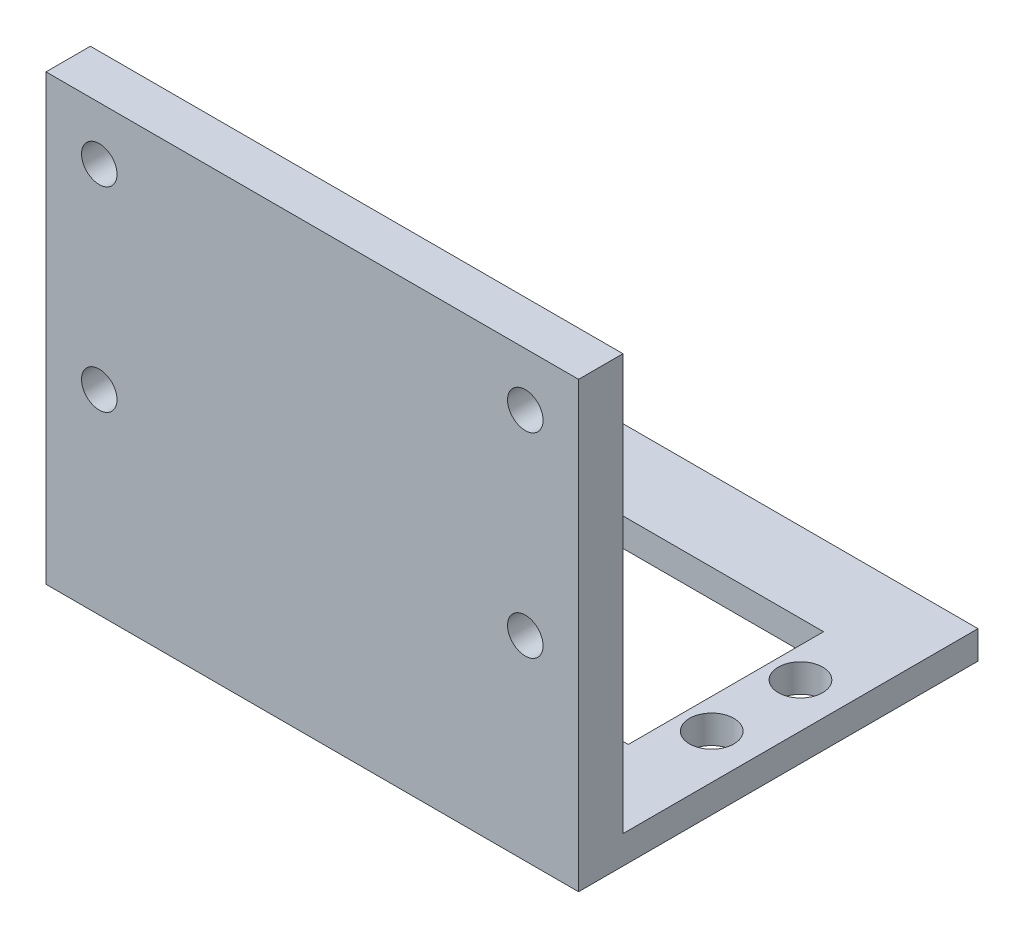
ISO-10303-21;
HEADER;
FILE_DESCRIPTION(('STEP AP214'),'2;1');
FILE_NAME('part.step','',(''),(''),'','','');
FILE_SCHEMA(('AUTOMOTIVE_DESIGN { 1 0 10303 214 1 1 1 1 }'));
ENDSEC;
DATA;
#1=APPLICATION_CONTEXT('core data for automotive mechanical design processes');
#2=APPLICATION_PROTOCOL_DEFINITION('international standard','automotive_design',2000,#1);
#3=PRODUCT_CONTEXT('',#1,'mechanical');
#4=PRODUCT('Part','Part','',(#3));
#5=PRODUCT_RELATED_PRODUCT_CATEGORY('part','',(#4));
#6=PRODUCT_DEFINITION_FORMATION('','',#4);
#7=PRODUCT_DEFINITION_CONTEXT('part definition',#1,'design');
#8=PRODUCT_DEFINITION('design','',#6,#7);
#9=PRODUCT_DEFINITION_SHAPE('','',#8);
#10=(LENGTH_UNIT() NAMED_UNIT(*) SI_UNIT(.MILLI.,.METRE.));
#11=(NAMED_UNIT(*) PLANE_ANGLE_UNIT() SI_UNIT($,.RADIAN.));
#12=(NAMED_UNIT(*) SI_UNIT($,.STERADIAN.) SOLID_ANGLE_UNIT());
#13=UNCERTAINTY_MEASURE_WITH_UNIT(LENGTH_MEASURE(1.E-05),#10,'distance_accuracy_value','');
#14=(GEOMETRIC_REPRESENTATION_CONTEXT(3) GLOBAL_UNCERTAINTY_ASSIGNED_CONTEXT((#13)) GLOBAL_UNIT_ASSIGNED_CONTEXT((#10,
#11,#12)) REPRESENTATION_CONTEXT('',''));
#15=CARTESIAN_POINT('',(0.,0.,0.));
#16=DIRECTION('',(0.,0.,1.));
#17=DIRECTION('',(1.,0.,0.));
#18=AXIS2_PLACEMENT_3D('',#15,#16,#17);
#19=CARTESIAN_POINT('',(0.,3.175,0.));
#20=DIRECTION('',(0.,1.,0.));
#21=DIRECTION('',(0.,0.,1.));
#22=AXIS2_PLACEMENT_3D('',#19,#20,#21);
#23=PLANE('',#22);
#24=CARTESIAN_POINT('',(-23.8,3.175,5.00000000000001));
#25=DIRECTION('',(0.,1.,0.));
#26=DIRECTION('',(0.,0.,1.));
#27=AXIS2_PLACEMENT_3D('',#24,#25,#26);
#28=CIRCLE('',#27,2.5);
#29=CARTESIAN_POINT('',(-23.8,3.175,7.50000000000001));
#30=VERTEX_POINT('',#29);
#31=EDGE_CURVE('E192',#30,#30,#28,.T.);
#32=ORIENTED_EDGE('',*,*,#31,.F.);
#33=EDGE_LOOP('',(#32));
#34=FACE_BOUND('',#33,.T.);
#35=CARTESIAN_POINT('',(-23.8,3.175,-4.99999999999999));
#36=DIRECTION('',(0.,1.,0.));
#37=DIRECTION('',(0.,0.,1.));
#38=AXIS2_PLACEMENT_3D('',#35,#36,#37);
#39=CIRCLE('',#38,2.5);
#40=CARTESIAN_POINT('',(-23.8,3.175,-2.49999999999999));
#41=VERTEX_POINT('',#40);
#42=EDGE_CURVE('E127',#41,#41,#39,.T.);
#43=ORIENTED_EDGE('',*,*,#42,.F.);
#44=EDGE_LOOP('',(#43));
#45=FACE_BOUND('',#44,.T.);
#46=DIRECTION('',(0.,0.,1.));
#47=VECTOR('',#46,1.);
#48=CARTESIAN_POINT('',(-30.,3.175,20.));
#49=LINE('',#48,#47);
#50=CARTESIAN_POINT('',(-30.,3.175,-20.));
#51=VERTEX_POINT('',#50);
#52=CARTESIAN_POINT('',(-30.,3.175,20.));
#53=VERTEX_POINT('',#52);
#54=EDGE_CURVE('E208',#51,#53,#49,.T.);
#55=ORIENTED_EDGE('',*,*,#54,.T.);
#56=DIRECTION('',(1.,0.,0.));
#57=VECTOR('',#56,1.);
#58=CARTESIAN_POINT('',(30.,3.175,20.));
#59=LINE('',#58,#57);
#60=CARTESIAN_POINT('',(30.,3.175,20.));
#61=VERTEX_POINT('',#60);
#62=EDGE_CURVE('E211',#53,#61,#59,.T.);
#63=ORIENTED_EDGE('',*,*,#62,.T.);
#64=DIRECTION('',(0.,0.,-1.));
#65=VECTOR('',#64,1.);
#66=CARTESIAN_POINT('',(30.,3.175,20.));
#67=LINE('',#66,#65);
#68=CARTESIAN_POINT('',(30.,3.175,-20.));
#69=VERTEX_POINT('',#68);
#70=EDGE_CURVE('E215',#61,#69,#67,.T.);
#71=ORIENTED_EDGE('',*,*,#70,.T.);
#72=DIRECTION('',(-1.,0.,0.));
#73=VECTOR('',#72,1.);
#74=CARTESIAN_POINT('',(30.,3.175,-20.));
#75=LINE('',#74,#73);
#76=EDGE_CURVE('E217',#69,#51,#75,.T.);
#77=ORIENTED_EDGE('',*,*,#76,.T.);
#78=EDGE_LOOP('',(#55,#63,#71,#77));
#79=FACE_BOUND('',#78,.T.);
#80=CARTESIAN_POINT('',(25.,3.175,-5.));
#81=DIRECTION('',(0.,1.,0.));
#82=DIRECTION('',(0.,0.,1.));
#83=AXIS2_PLACEMENT_3D('',#80,#81,#82);
#84=CIRCLE('',#83,2.5);
#85=CARTESIAN_POINT('',(25.,3.175,-2.5));
#86=VERTEX_POINT('',#85);
#87=EDGE_CURVE('E198',#86,#86,#84,.T.);
#88=ORIENTED_EDGE('',*,*,#87,.F.);
#89=EDGE_LOOP('',(#88));
#90=FACE_BOUND('',#89,.T.);
#91=CARTESIAN_POINT('',(25.,3.175,5.));
#92=DIRECTION('',(0.,1.,0.));
#93=DIRECTION('',(0.,0.,1.));
#94=AXIS2_PLACEMENT_3D('',#91,#92,#93);
#95=CIRCLE('',#94,2.5);
#96=CARTESIAN_POINT('',(25.,3.175,7.5));
#97=VERTEX_POINT('',#96);
#98=EDGE_CURVE('E186',#97,#97,#95,.T.);
#99=ORIENTED_EDGE('',*,*,#98,.F.);
#100=EDGE_LOOP('',(#99));
#101=FACE_BOUND('',#100,.T.);
#102=DIRECTION('',(1.,0.,0.));
#103=VECTOR('',#102,1.);
#104=CARTESIAN_POINT('',(21.6,3.175,11.));
#105=LINE('',#104,#103);
#106=CARTESIAN_POINT('',(-20.4,3.175,11.));
#107=VERTEX_POINT('',#106);
#108=CARTESIAN_POINT('',(21.6,3.175,11.));
#109=VERTEX_POINT('',#108);
#110=EDGE_CURVE('E162',#107,#109,#105,.T.);
#111=ORIENTED_EDGE('',*,*,#110,.F.);
#112=DIRECTION('',(0.,0.,1.));
#113=VECTOR('',#112,1.);
#114=CARTESIAN_POINT('',(-20.4,3.175,11.));
#115=LINE('',#114,#113);
#116=CARTESIAN_POINT('',(-20.4,3.175,-11.));
#117=VERTEX_POINT('',#116);
#118=EDGE_CURVE('E160',#117,#107,#115,.T.);
#119=ORIENTED_EDGE('',*,*,#118,.F.);
#120=DIRECTION('',(-1.,0.,0.));
#121=VECTOR('',#120,1.);
#122=CARTESIAN_POINT('',(21.6,3.175,-11.));
#123=LINE('',#122,#121);
#124=CARTESIAN_POINT('',(21.6,3.175,-11.));
#125=VERTEX_POINT('',#124);
#126=EDGE_CURVE('E167',#125,#117,#123,.T.);
#127=ORIENTED_EDGE('',*,*,#126,.F.);
#128=DIRECTION('',(0.,0.,-1.));
#129=VECTOR('',#128,1.);
#130=CARTESIAN_POINT('',(21.6,3.175,11.));
#131=LINE('',#130,#129);
#132=EDGE_CURVE('E165',#109,#125,#131,.T.);
#133=ORIENTED_EDGE('',*,*,#132,.F.);
#134=EDGE_LOOP('',(#111,#119,#127,#133));
#135=FACE_BOUND('',#134,.T.);
#136=ADVANCED_FACE('F37',(#34,#45,#79,#90,#101,#135),#23,.T.);
#137=CARTESIAN_POINT('',(0.,0.,0.));
#138=DIRECTION('',(0.,1.,0.));
#139=DIRECTION('',(0.,0.,1.));
#140=AXIS2_PLACEMENT_3D('',#137,#138,#139);
#141=PLANE('',#140);
#142=CARTESIAN_POINT('',(25.,0.,5.));
#143=DIRECTION('',(0.,1.,0.));
#144=DIRECTION('',(0.,0.,1.));
#145=AXIS2_PLACEMENT_3D('',#142,#143,#144);
#146=CIRCLE('',#145,2.5);
#147=CARTESIAN_POINT('',(25.,0.,7.5));
#148=VERTEX_POINT('',#147);
#149=EDGE_CURVE('E185',#148,#148,#146,.T.);
#150=ORIENTED_EDGE('',*,*,#149,.T.);
#151=EDGE_LOOP('',(#150));
#152=FACE_BOUND('',#151,.T.);
#153=CARTESIAN_POINT('',(-23.8,0.,5.00000000000001));
#154=DIRECTION('',(0.,1.,0.));
#155=DIRECTION('',(0.,0.,1.));
#156=AXIS2_PLACEMENT_3D('',#153,#154,#155);
#157=CIRCLE('',#156,2.5);
#158=CARTESIAN_POINT('',(-23.8,0.,7.50000000000001));
#159=VERTEX_POINT('',#158);
#160=EDGE_CURVE('E189',#159,#159,#157,.T.);
#161=ORIENTED_EDGE('',*,*,#160,.T.);
#162=EDGE_LOOP('',(#161));
#163=FACE_BOUND('',#162,.T.);
#164=CARTESIAN_POINT('',(25.,0.,-5.));
#165=DIRECTION('',(0.,1.,0.));
#166=DIRECTION('',(0.,0.,1.));
#167=AXIS2_PLACEMENT_3D('',#164,#165,#166);
#168=CIRCLE('',#167,2.5);
#169=CARTESIAN_POINT('',(25.,0.,-2.5));
#170=VERTEX_POINT('',#169);
#171=EDGE_CURVE('E195',#170,#170,#168,.T.);
#172=ORIENTED_EDGE('',*,*,#171,.T.);
#173=EDGE_LOOP('',(#172));
#174=FACE_BOUND('',#173,.T.);
#175=CARTESIAN_POINT('',(-23.8,0.,-4.99999999999999));
#176=DIRECTION('',(0.,1.,0.));
#177=DIRECTION('',(0.,0.,1.));
#178=AXIS2_PLACEMENT_3D('',#175,#176,#177);
#179=CIRCLE('',#178,2.5);
#180=CARTESIAN_POINT('',(-23.8,0.,-2.49999999999999));
#181=VERTEX_POINT('',#180);
#182=EDGE_CURVE('E201',#181,#181,#179,.T.);
#183=ORIENTED_EDGE('',*,*,#182,.T.);
#184=EDGE_LOOP('',(#183));
#185=FACE_BOUND('',#184,.T.);
#186=DIRECTION('',(0.,0.,1.));
#187=VECTOR('',#186,1.);
#188=CARTESIAN_POINT('',(-30.,0.,20.));
#189=LINE('',#188,#187);
#190=CARTESIAN_POINT('',(-30.,0.,-20.));
#191=VERTEX_POINT('',#190);
#192=CARTESIAN_POINT('',(-30.,0.,25.));
#193=VERTEX_POINT('',#192);
#194=EDGE_CURVE('E117',#191,#193,#189,.T.);
#195=ORIENTED_EDGE('',*,*,#194,.F.);
#196=DIRECTION('',(-1.,0.,0.));
#197=VECTOR('',#196,1.);
#198=CARTESIAN_POINT('',(30.,0.,-20.));
#199=LINE('',#198,#197);
#200=CARTESIAN_POINT('',(30.,0.,-20.));
#201=VERTEX_POINT('',#200);
#202=EDGE_CURVE('E212',#201,#191,#199,.T.);
#203=ORIENTED_EDGE('',*,*,#202,.F.);
#204=DIRECTION('',(0.,0.,-1.));
#205=VECTOR('',#204,1.);
#206=CARTESIAN_POINT('',(30.,0.,20.));
#207=LINE('',#206,#205);
#208=CARTESIAN_POINT('',(30.,0.,25.));
#209=VERTEX_POINT('',#208);
#210=EDGE_CURVE('E126',#209,#201,#207,.T.);
#211=ORIENTED_EDGE('',*,*,#210,.F.);
#212=DIRECTION('',(1.,0.,0.));
#213=VECTOR('',#212,1.);
#214=CARTESIAN_POINT('',(-30.,0.,25.));
#215=LINE('',#214,#213);
#216=EDGE_CURVE('E130',#193,#209,#215,.T.);
#217=ORIENTED_EDGE('',*,*,#216,.F.);
#218=EDGE_LOOP('',(#195,#203,#211,#217));
#219=FACE_BOUND('',#218,.T.);
#220=DIRECTION('',(0.,0.,1.));
#221=VECTOR('',#220,1.);
#222=CARTESIAN_POINT('',(-20.4,0.,11.));
#223=LINE('',#222,#221);
#224=CARTESIAN_POINT('',(-20.4,0.,-11.));
#225=VERTEX_POINT('',#224);
#226=CARTESIAN_POINT('',(-20.4,0.,11.));
#227=VERTEX_POINT('',#226);
#228=EDGE_CURVE('E60',#225,#227,#223,.T.);
#229=ORIENTED_EDGE('',*,*,#228,.T.);
#230=DIRECTION('',(1.,0.,0.));
#231=VECTOR('',#230,1.);
#232=CARTESIAN_POINT('',(21.6,0.,11.));
#233=LINE('',#232,#231);
#234=CARTESIAN_POINT('',(21.6,0.,11.));
#235=VERTEX_POINT('',#234);
#236=EDGE_CURVE('E171',#227,#235,#233,.T.);
#237=ORIENTED_EDGE('',*,*,#236,.T.);
#238=DIRECTION('',(0.,0.,-1.));
#239=VECTOR('',#238,1.);
#240=CARTESIAN_POINT('',(21.6,0.,11.));
#241=LINE('',#240,#239);
#242=CARTESIAN_POINT('',(21.6,0.,-11.));
#243=VERTEX_POINT('',#242);
#244=EDGE_CURVE('E174',#235,#243,#241,.T.);
#245=ORIENTED_EDGE('',*,*,#244,.T.);
#246=DIRECTION('',(-1.,0.,0.));
#247=VECTOR('',#246,1.);
#248=CARTESIAN_POINT('',(21.6,0.,-11.));
#249=LINE('',#248,#247);
#250=EDGE_CURVE('E163',#243,#225,#249,.T.);
#251=ORIENTED_EDGE('',*,*,#250,.T.);
#252=EDGE_LOOP('',(#229,#237,#245,#251));
#253=FACE_BOUND('',#252,.T.);
#254=ADVANCED_FACE('F131',(#152,#163,#174,#185,#219,#253),#141,.F.);
#255=CARTESIAN_POINT('',(-30.,3.175,20.));
#256=DIRECTION('',(1.,0.,0.));
#257=DIRECTION('',(0.,0.,-1.));
#258=AXIS2_PLACEMENT_3D('',#255,#256,#257);
#259=PLANE('',#258);
#260=ORIENTED_EDGE('',*,*,#194,.T.);
#261=DIRECTION('',(0.,-1.,0.));
#262=VECTOR('',#261,1.);
#263=CARTESIAN_POINT('',(-30.,0.,25.));
#264=LINE('',#263,#262);
#265=CARTESIAN_POINT('',(-30.,50.,25.));
#266=VERTEX_POINT('',#265);
#267=EDGE_CURVE('E121',#266,#193,#264,.T.);
#268=ORIENTED_EDGE('',*,*,#267,.F.);
#269=DIRECTION('',(0.,0.,-1.));
#270=VECTOR('',#269,1.);
#271=CARTESIAN_POINT('',(-30.,50.,25.));
#272=LINE('',#271,#270);
#273=CARTESIAN_POINT('',(-30.,50.,20.));
#274=VERTEX_POINT('',#273);
#275=EDGE_CURVE('E151',#266,#274,#272,.T.);
#276=ORIENTED_EDGE('',*,*,#275,.T.);
#277=DIRECTION('',(0.,-1.,0.));
#278=VECTOR('',#277,1.);
#279=CARTESIAN_POINT('',(-30.,0.,20.));
#280=LINE('',#279,#278);
#281=EDGE_CURVE('E152',#274,#53,#280,.T.);
#282=ORIENTED_EDGE('',*,*,#281,.T.);
#283=ORIENTED_EDGE('',*,*,#54,.F.);
#284=DIRECTION('',(0.,-1.,0.));
#285=VECTOR('',#284,1.);
#286=CARTESIAN_POINT('',(-30.,3.175,-20.));
#287=LINE('',#286,#285);
#288=EDGE_CURVE('E45',#51,#191,#287,.T.);
#289=ORIENTED_EDGE('',*,*,#288,.T.);
#290=EDGE_LOOP('',(#260,#268,#276,#282,#283,#289));
#291=FACE_BOUND('',#290,.T.);
#292=ADVANCED_FACE('F39',(#291),#259,.F.);
#293=CARTESIAN_POINT('',(30.,3.175,20.));
#294=DIRECTION('',(-1.,0.,0.));
#295=DIRECTION('',(0.,0.,1.));
#296=AXIS2_PLACEMENT_3D('',#293,#294,#295);
#297=PLANE('',#296);
#298=ORIENTED_EDGE('',*,*,#210,.T.);
#299=DIRECTION('',(0.,-1.,0.));
#300=VECTOR('',#299,1.);
#301=CARTESIAN_POINT('',(30.,3.175,-20.));
#302=LINE('',#301,#300);
#303=EDGE_CURVE('E11',#69,#201,#302,.T.);
#304=ORIENTED_EDGE('',*,*,#303,.F.);
#305=ORIENTED_EDGE('',*,*,#70,.F.);
#306=DIRECTION('',(0.,1.,0.));
#307=VECTOR('',#306,1.);
#308=CARTESIAN_POINT('',(30.,0.,20.));
#309=LINE('',#308,#307);
#310=CARTESIAN_POINT('',(30.,50.,20.));
#311=VERTEX_POINT('',#310);
#312=EDGE_CURVE('E143',#61,#311,#309,.T.);
#313=ORIENTED_EDGE('',*,*,#312,.T.);
#314=DIRECTION('',(0.,0.,-1.));
#315=VECTOR('',#314,1.);
#316=CARTESIAN_POINT('',(30.,50.,25.));
#317=LINE('',#316,#315);
#318=CARTESIAN_POINT('',(30.,50.,25.));
#319=VERTEX_POINT('',#318);
#320=EDGE_CURVE('E157',#319,#311,#317,.T.);
#321=ORIENTED_EDGE('',*,*,#320,.F.);
#322=DIRECTION('',(0.,1.,0.));
#323=VECTOR('',#322,1.);
#324=CARTESIAN_POINT('',(30.,0.,25.));
#325=LINE('',#324,#323);
#326=EDGE_CURVE('E135',#209,#319,#325,.T.);
#327=ORIENTED_EDGE('',*,*,#326,.F.);
#328=EDGE_LOOP('',(#298,#304,#305,#313,#321,#327));
#329=FACE_BOUND('',#328,.T.);
#330=ADVANCED_FACE('F226',(#329),#297,.F.);
#331=CARTESIAN_POINT('',(30.,3.175,-20.));
#332=DIRECTION('',(0.,0.,1.));
#333=DIRECTION('',(1.,0.,0.));
#334=AXIS2_PLACEMENT_3D('',#331,#332,#333);
#335=PLANE('',#334);
#336=ORIENTED_EDGE('',*,*,#202,.T.);
#337=ORIENTED_EDGE('',*,*,#288,.F.);
#338=ORIENTED_EDGE('',*,*,#76,.F.);
#339=ORIENTED_EDGE('',*,*,#303,.T.);
#340=EDGE_LOOP('',(#336,#337,#338,#339));
#341=FACE_BOUND('',#340,.T.);
#342=ADVANCED_FACE('F221',(#341),#335,.F.);
#343=CARTESIAN_POINT('',(-23.8,3.175,-4.99999999999999));
#344=DIRECTION('',(0.,-1.,0.));
#345=DIRECTION('',(0.,0.,-1.));
#346=AXIS2_PLACEMENT_3D('',#343,#344,#345);
#347=CYLINDRICAL_SURFACE('',#346,2.5);
#348=ORIENTED_EDGE('',*,*,#42,.T.);
#349=EDGE_LOOP('',(#348));
#350=FACE_BOUND('',#349,.T.);
#351=ORIENTED_EDGE('',*,*,#182,.F.);
#352=EDGE_LOOP('',(#351));
#353=FACE_BOUND('',#352,.T.);
#354=ADVANCED_FACE('F282',(#350,#353),#347,.F.);
#355=CARTESIAN_POINT('',(25.,3.175,-5.));
#356=DIRECTION('',(0.,-1.,0.));
#357=DIRECTION('',(0.,0.,-1.));
#358=AXIS2_PLACEMENT_3D('',#355,#356,#357);
#359=CYLINDRICAL_SURFACE('',#358,2.5);
#360=ORIENTED_EDGE('',*,*,#87,.T.);
#361=EDGE_LOOP('',(#360));
#362=FACE_BOUND('',#361,.T.);
#363=ORIENTED_EDGE('',*,*,#171,.F.);
#364=EDGE_LOOP('',(#363));
#365=FACE_BOUND('',#364,.T.);
#366=ADVANCED_FACE('F278',(#362,#365),#359,.F.);
#367=CARTESIAN_POINT('',(-23.8,3.175,5.00000000000001));
#368=DIRECTION('',(0.,-1.,0.));
#369=DIRECTION('',(0.,0.,-1.));
#370=AXIS2_PLACEMENT_3D('',#367,#368,#369);
#371=CYLINDRICAL_SURFACE('',#370,2.5);
#372=ORIENTED_EDGE('',*,*,#31,.T.);
#373=EDGE_LOOP('',(#372));
#374=FACE_BOUND('',#373,.T.);
#375=ORIENTED_EDGE('',*,*,#160,.F.);
#376=EDGE_LOOP('',(#375));
#377=FACE_BOUND('',#376,.T.);
#378=ADVANCED_FACE('F274',(#374,#377),#371,.F.);
#379=CARTESIAN_POINT('',(25.,3.175,5.));
#380=DIRECTION('',(0.,-1.,0.));
#381=DIRECTION('',(0.,0.,-1.));
#382=AXIS2_PLACEMENT_3D('',#379,#380,#381);
#383=CYLINDRICAL_SURFACE('',#382,2.5);
#384=ORIENTED_EDGE('',*,*,#98,.T.);
#385=EDGE_LOOP('',(#384));
#386=FACE_BOUND('',#385,.T.);
#387=ORIENTED_EDGE('',*,*,#149,.F.);
#388=EDGE_LOOP('',(#387));
#389=FACE_BOUND('',#388,.T.);
#390=ADVANCED_FACE('F271',(#386,#389),#383,.F.);
#391=CARTESIAN_POINT('',(-20.4,3.175,11.));
#392=DIRECTION('',(1.,0.,0.));
#393=DIRECTION('',(0.,0.,-1.));
#394=AXIS2_PLACEMENT_3D('',#391,#392,#393);
#395=PLANE('',#394);
#396=ORIENTED_EDGE('',*,*,#228,.F.);
#397=DIRECTION('',(0.,-1.,0.));
#398=VECTOR('',#397,1.);
#399=CARTESIAN_POINT('',(-20.4,3.175,-11.));
#400=LINE('',#399,#398);
#401=EDGE_CURVE('E169',#117,#225,#400,.T.);
#402=ORIENTED_EDGE('',*,*,#401,.F.);
#403=ORIENTED_EDGE('',*,*,#118,.T.);
#404=DIRECTION('',(0.,-1.,0.));
#405=VECTOR('',#404,1.);
#406=CARTESIAN_POINT('',(-20.4,3.175,11.));
#407=LINE('',#406,#405);
#408=EDGE_CURVE('E183',#107,#227,#407,.T.);
#409=ORIENTED_EDGE('',*,*,#408,.T.);
#410=EDGE_LOOP('',(#396,#402,#403,#409));
#411=FACE_BOUND('',#410,.T.);
#412=ADVANCED_FACE('F254',(#411),#395,.T.);
#413=CARTESIAN_POINT('',(21.6,3.175,11.));
#414=DIRECTION('',(0.,0.,-1.));
#415=DIRECTION('',(-1.,0.,0.));
#416=AXIS2_PLACEMENT_3D('',#413,#414,#415);
#417=PLANE('',#416);
#418=ORIENTED_EDGE('',*,*,#236,.F.);
#419=ORIENTED_EDGE('',*,*,#408,.F.);
#420=ORIENTED_EDGE('',*,*,#110,.T.);
#421=DIRECTION('',(0.,-1.,0.));
#422=VECTOR('',#421,1.);
#423=CARTESIAN_POINT('',(21.6,3.175,11.));
#424=LINE('',#423,#422);
#425=EDGE_CURVE('E181',#109,#235,#424,.T.);
#426=ORIENTED_EDGE('',*,*,#425,.T.);
#427=EDGE_LOOP('',(#418,#419,#420,#426));
#428=FACE_BOUND('',#427,.T.);
#429=ADVANCED_FACE('F250',(#428),#417,.T.);
#430=CARTESIAN_POINT('',(21.6,3.175,11.));
#431=DIRECTION('',(-1.,0.,0.));
#432=DIRECTION('',(0.,0.,1.));
#433=AXIS2_PLACEMENT_3D('',#430,#431,#432);
#434=PLANE('',#433);
#435=ORIENTED_EDGE('',*,*,#244,.F.);
#436=ORIENTED_EDGE('',*,*,#425,.F.);
#437=ORIENTED_EDGE('',*,*,#132,.T.);
#438=DIRECTION('',(0.,-1.,0.));
#439=VECTOR('',#438,1.);
#440=CARTESIAN_POINT('',(21.6,3.175,-11.));
#441=LINE('',#440,#439);
#442=EDGE_CURVE('E52',#125,#243,#441,.T.);
#443=ORIENTED_EDGE('',*,*,#442,.T.);
#444=EDGE_LOOP('',(#435,#436,#437,#443));
#445=FACE_BOUND('',#444,.T.);
#446=ADVANCED_FACE('F253',(#445),#434,.T.);
#447=CARTESIAN_POINT('',(21.6,3.175,-11.));
#448=DIRECTION('',(0.,0.,1.));
#449=DIRECTION('',(1.,0.,0.));
#450=AXIS2_PLACEMENT_3D('',#447,#448,#449);
#451=PLANE('',#450);
#452=ORIENTED_EDGE('',*,*,#250,.F.);
#453=ORIENTED_EDGE('',*,*,#442,.F.);
#454=ORIENTED_EDGE('',*,*,#126,.T.);
#455=ORIENTED_EDGE('',*,*,#401,.T.);
#456=EDGE_LOOP('',(#452,#453,#454,#455));
#457=FACE_BOUND('',#456,.T.);
#458=ADVANCED_FACE('F255',(#457),#451,.T.);
#459=CARTESIAN_POINT('',(0.,0.,20.));
#460=DIRECTION('',(0.,0.,-1.));
#461=DIRECTION('',(-1.,0.,0.));
#462=AXIS2_PLACEMENT_3D('',#459,#460,#461);
#463=PLANE('',#462);
#464=CARTESIAN_POINT('',(24.,44.,20.));
#465=DIRECTION('',(0.,0.,-1.));
#466=DIRECTION('',(-1.,0.,0.));
#467=AXIS2_PLACEMENT_3D('',#464,#465,#466);
#468=CIRCLE('',#467,1.99999999999999);
#469=CARTESIAN_POINT('',(22.,44.,20.));
#470=VERTEX_POINT('',#469);
#471=EDGE_CURVE('E446',#470,#470,#468,.T.);
#472=ORIENTED_EDGE('',*,*,#471,.F.);
#473=EDGE_LOOP('',(#472));
#474=FACE_BOUND('',#473,.T.);
#475=CARTESIAN_POINT('',(-24.,44.,20.));
#476=DIRECTION('',(0.,0.,-1.));
#477=DIRECTION('',(-1.,0.,0.));
#478=AXIS2_PLACEMENT_3D('',#475,#476,#477);
#479=CIRCLE('',#478,1.99999999999999);
#480=CARTESIAN_POINT('',(-26.,44.,20.));
#481=VERTEX_POINT('',#480);
#482=EDGE_CURVE('E448',#481,#481,#479,.T.);
#483=ORIENTED_EDGE('',*,*,#482,.F.);
#484=EDGE_LOOP('',(#483));
#485=FACE_BOUND('',#484,.T.);
#486=CARTESIAN_POINT('',(24.,22.,20.));
#487=DIRECTION('',(0.,0.,-1.));
#488=DIRECTION('',(-1.,0.,0.));
#489=AXIS2_PLACEMENT_3D('',#486,#487,#488);
#490=CIRCLE('',#489,1.99999999999999);
#491=CARTESIAN_POINT('',(22.,22.,20.));
#492=VERTEX_POINT('',#491);
#493=EDGE_CURVE('E456',#492,#492,#490,.T.);
#494=ORIENTED_EDGE('',*,*,#493,.F.);
#495=EDGE_LOOP('',(#494));
#496=FACE_BOUND('',#495,.T.);
#497=CARTESIAN_POINT('',(-24.,22.,20.));
#498=DIRECTION('',(0.,0.,-1.));
#499=DIRECTION('',(-1.,0.,0.));
#500=AXIS2_PLACEMENT_3D('',#497,#498,#499);
#501=CIRCLE('',#500,1.99999999999999);
#502=CARTESIAN_POINT('',(-26.,22.,20.));
#503=VERTEX_POINT('',#502);
#504=EDGE_CURVE('E461',#503,#503,#501,.T.);
#505=ORIENTED_EDGE('',*,*,#504,.F.);
#506=EDGE_LOOP('',(#505));
#507=FACE_BOUND('',#506,.T.);
#508=ORIENTED_EDGE('',*,*,#62,.F.);
#509=ORIENTED_EDGE('',*,*,#281,.F.);
#510=DIRECTION('',(-1.,0.,0.));
#511=VECTOR('',#510,1.);
#512=CARTESIAN_POINT('',(-30.,50.,20.));
#513=LINE('',#512,#511);
#514=EDGE_CURVE('E141',#311,#274,#513,.T.);
#515=ORIENTED_EDGE('',*,*,#514,.F.);
#516=ORIENTED_EDGE('',*,*,#312,.F.);
#517=EDGE_LOOP('',(#508,#509,#515,#516));
#518=FACE_BOUND('',#517,.T.);
#519=ADVANCED_FACE('F233',(#474,#485,#496,#507,#518),#463,.T.);
#520=CARTESIAN_POINT('',(-30.,50.,25.));
#521=DIRECTION('',(0.,-1.,0.));
#522=DIRECTION('',(0.,0.,-1.));
#523=AXIS2_PLACEMENT_3D('',#520,#521,#522);
#524=PLANE('',#523);
#525=ORIENTED_EDGE('',*,*,#514,.T.);
#526=ORIENTED_EDGE('',*,*,#275,.F.);
#527=DIRECTION('',(-1.,0.,0.));
#528=VECTOR('',#527,1.);
#529=CARTESIAN_POINT('',(-30.,50.,25.));
#530=LINE('',#529,#528);
#531=EDGE_CURVE('E139',#319,#266,#530,.T.);
#532=ORIENTED_EDGE('',*,*,#531,.F.);
#533=ORIENTED_EDGE('',*,*,#320,.T.);
#534=EDGE_LOOP('',(#525,#526,#532,#533));
#535=FACE_BOUND('',#534,.T.);
#536=ADVANCED_FACE('F230',(#535),#524,.F.);
#537=CARTESIAN_POINT('',(0.,0.,25.));
#538=DIRECTION('',(0.,0.,-1.));
#539=DIRECTION('',(-1.,0.,0.));
#540=AXIS2_PLACEMENT_3D('',#537,#538,#539);
#541=PLANE('',#540);
#542=CARTESIAN_POINT('',(24.,44.,25.));
#543=DIRECTION('',(0.,0.,-1.));
#544=DIRECTION('',(-1.,0.,0.));
#545=AXIS2_PLACEMENT_3D('',#542,#543,#544);
#546=CIRCLE('',#545,2.);
#547=CARTESIAN_POINT('',(22.,44.,25.));
#548=VERTEX_POINT('',#547);
#549=EDGE_CURVE('E443',#548,#548,#546,.T.);
#550=ORIENTED_EDGE('',*,*,#549,.T.);
#551=EDGE_LOOP('',(#550));
#552=FACE_BOUND('',#551,.T.);
#553=CARTESIAN_POINT('',(-24.,44.,25.));
#554=DIRECTION('',(0.,0.,-1.));
#555=DIRECTION('',(-1.,0.,0.));
#556=AXIS2_PLACEMENT_3D('',#553,#554,#555);
#557=CIRCLE('',#556,2.);
#558=CARTESIAN_POINT('',(-26.,44.,25.));
#559=VERTEX_POINT('',#558);
#560=EDGE_CURVE('E453',#559,#559,#557,.T.);
#561=ORIENTED_EDGE('',*,*,#560,.T.);
#562=EDGE_LOOP('',(#561));
#563=FACE_BOUND('',#562,.T.);
#564=CARTESIAN_POINT('',(24.,22.,25.));
#565=DIRECTION('',(0.,0.,-1.));
#566=DIRECTION('',(-1.,0.,0.));
#567=AXIS2_PLACEMENT_3D('',#564,#565,#566);
#568=CIRCLE('',#567,2.);
#569=CARTESIAN_POINT('',(22.,22.,25.));
#570=VERTEX_POINT('',#569);
#571=EDGE_CURVE('E459',#570,#570,#568,.T.);
#572=ORIENTED_EDGE('',*,*,#571,.T.);
#573=EDGE_LOOP('',(#572));
#574=FACE_BOUND('',#573,.T.);
#575=CARTESIAN_POINT('',(-24.,22.,25.));
#576=DIRECTION('',(0.,0.,-1.));
#577=DIRECTION('',(-1.,0.,0.));
#578=AXIS2_PLACEMENT_3D('',#575,#576,#577);
#579=CIRCLE('',#578,2.);
#580=CARTESIAN_POINT('',(-26.,22.,25.));
#581=VERTEX_POINT('',#580);
#582=EDGE_CURVE('E146',#581,#581,#579,.T.);
#583=ORIENTED_EDGE('',*,*,#582,.T.);
#584=EDGE_LOOP('',(#583));
#585=FACE_BOUND('',#584,.T.);
#586=ORIENTED_EDGE('',*,*,#267,.T.);
#587=ORIENTED_EDGE('',*,*,#216,.T.);
#588=ORIENTED_EDGE('',*,*,#326,.T.);
#589=ORIENTED_EDGE('',*,*,#531,.T.);
#590=EDGE_LOOP('',(#586,#587,#588,#589));
#591=FACE_BOUND('',#590,.T.);
#592=ADVANCED_FACE('F137',(#552,#563,#574,#585,#591),#541,.F.);
#593=CARTESIAN_POINT('',(-24.,22.,20.));
#594=DIRECTION('',(0.,0.,-1.));
#595=DIRECTION('',(-1.,0.,0.));
#596=AXIS2_PLACEMENT_3D('',#593,#594,#595);
#597=CYLINDRICAL_SURFACE('',#596,1.99999999999999);
#598=ORIENTED_EDGE('',*,*,#582,.F.);
#599=EDGE_LOOP('',(#598));
#600=FACE_BOUND('',#599,.T.);
#601=ORIENTED_EDGE('',*,*,#504,.T.);
#602=EDGE_LOOP('',(#601));
#603=FACE_BOUND('',#602,.T.);
#604=ADVANCED_FACE('F395',(#600,#603),#597,.F.);
#605=CARTESIAN_POINT('',(24.,22.,20.));
#606=DIRECTION('',(0.,0.,-1.));
#607=DIRECTION('',(-1.,0.,0.));
#608=AXIS2_PLACEMENT_3D('',#605,#606,#607);
#609=CYLINDRICAL_SURFACE('',#608,1.99999999999999);
#610=ORIENTED_EDGE('',*,*,#571,.F.);
#611=EDGE_LOOP('',(#610));
#612=FACE_BOUND('',#611,.T.);
#613=ORIENTED_EDGE('',*,*,#493,.T.);
#614=EDGE_LOOP('',(#613));
#615=FACE_BOUND('',#614,.T.);
#616=ADVANCED_FACE('F404',(#612,#615),#609,.F.);
#617=CARTESIAN_POINT('',(-24.,44.,20.));
#618=DIRECTION('',(0.,0.,-1.));
#619=DIRECTION('',(-1.,0.,0.));
#620=AXIS2_PLACEMENT_3D('',#617,#618,#619);
#621=CYLINDRICAL_SURFACE('',#620,1.99999999999999);
#622=ORIENTED_EDGE('',*,*,#560,.F.);
#623=EDGE_LOOP('',(#622));
#624=FACE_BOUND('',#623,.T.);
#625=ORIENTED_EDGE('',*,*,#482,.T.);
#626=EDGE_LOOP('',(#625));
#627=FACE_BOUND('',#626,.T.);
#628=ADVANCED_FACE('F413',(#624,#627),#621,.F.);
#629=CARTESIAN_POINT('',(24.,44.,20.));
#630=DIRECTION('',(0.,0.,-1.));
#631=DIRECTION('',(-1.,0.,0.));
#632=AXIS2_PLACEMENT_3D('',#629,#630,#631);
#633=CYLINDRICAL_SURFACE('',#632,1.99999999999999);
#634=ORIENTED_EDGE('',*,*,#549,.F.);
#635=EDGE_LOOP('',(#634));
#636=FACE_BOUND('',#635,.T.);
#637=ORIENTED_EDGE('',*,*,#471,.T.);
#638=EDGE_LOOP('',(#637));
#639=FACE_BOUND('',#638,.T.);
#640=ADVANCED_FACE('F422',(#636,#639),#633,.F.);
#641=CLOSED_SHELL('',(#136,#254,#292,#330,#342,#354,#366,#378,#390,#412,#429,#446,#458,#519,
#536,#592,#604,#616,#628,#640));
#642=MANIFOLD_SOLID_BREP('B2',#641);
#643=ADVANCED_BREP_SHAPE_REPRESENTATION('',(#18,#642),#14);
#644=SHAPE_DEFINITION_REPRESENTATION(#9,#643);
ENDSEC;
END-ISO-10303-21;
